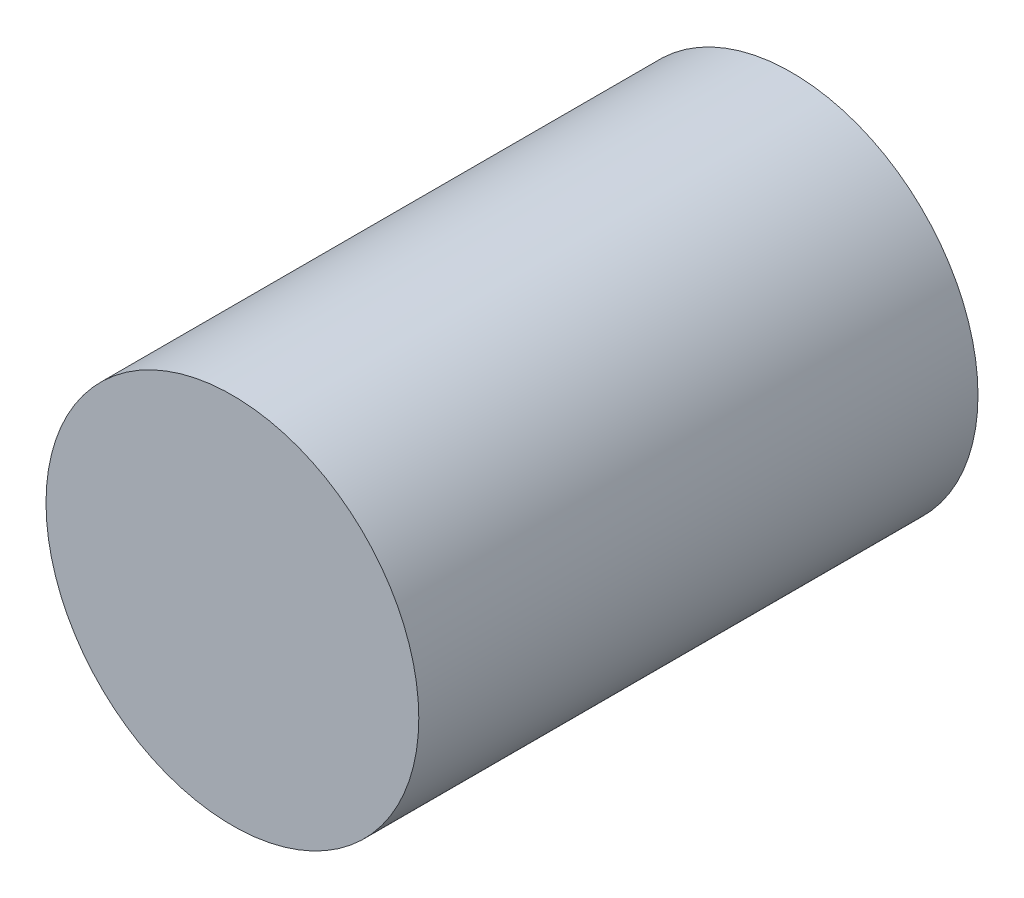
ISO-10303-21;
HEADER;
FILE_DESCRIPTION(('STEP AP214'),'2;1');
FILE_NAME('part.step','',(''),(''),'','','');
FILE_SCHEMA(('AUTOMOTIVE_DESIGN { 1 0 10303 214 1 1 1 1 }'));
ENDSEC;
DATA;
#1=APPLICATION_CONTEXT('core data for automotive mechanical design processes');
#2=APPLICATION_PROTOCOL_DEFINITION('international standard','automotive_design',2000,#1);
#3=PRODUCT_CONTEXT('',#1,'mechanical');
#4=PRODUCT('Part','Part','',(#3));
#5=PRODUCT_RELATED_PRODUCT_CATEGORY('part','',(#4));
#6=PRODUCT_DEFINITION_FORMATION('','',#4);
#7=PRODUCT_DEFINITION_CONTEXT('part definition',#1,'design');
#8=PRODUCT_DEFINITION('design','',#6,#7);
#9=PRODUCT_DEFINITION_SHAPE('','',#8);
#10=(LENGTH_UNIT() NAMED_UNIT(*) SI_UNIT(.MILLI.,.METRE.));
#11=(NAMED_UNIT(*) PLANE_ANGLE_UNIT() SI_UNIT($,.RADIAN.));
#12=(NAMED_UNIT(*) SI_UNIT($,.STERADIAN.) SOLID_ANGLE_UNIT());
#13=UNCERTAINTY_MEASURE_WITH_UNIT(LENGTH_MEASURE(1.E-05),#10,'distance_accuracy_value','');
#14=(GEOMETRIC_REPRESENTATION_CONTEXT(3) GLOBAL_UNCERTAINTY_ASSIGNED_CONTEXT((#13)) GLOBAL_UNIT_ASSIGNED_CONTEXT((#10,
#11,#12)) REPRESENTATION_CONTEXT('',''));
#15=CARTESIAN_POINT('',(0.,0.,0.));
#16=DIRECTION('',(0.,0.,1.));
#17=DIRECTION('',(1.,0.,0.));
#18=AXIS2_PLACEMENT_3D('',#15,#16,#17);
#19=CARTESIAN_POINT('',(0.,0.,27.));
#20=DIRECTION('',(0.,0.,-1.));
#21=DIRECTION('',(-1.,0.,0.));
#22=AXIS2_PLACEMENT_3D('',#19,#20,#21);
#23=CYLINDRICAL_SURFACE('',#22,9.);
#24=CARTESIAN_POINT('',(0.,0.,27.));
#25=DIRECTION('',(0.,0.,1.));
#26=DIRECTION('',(1.,0.,0.));
#27=AXIS2_PLACEMENT_3D('',#24,#25,#26);
#28=CIRCLE('',#27,9.);
#29=CARTESIAN_POINT('',(9.,0.,27.));
#30=VERTEX_POINT('',#29);
#31=EDGE_CURVE('E10',#30,#30,#28,.T.);
#32=ORIENTED_EDGE('',*,*,#31,.F.);
#33=EDGE_LOOP('',(#32));
#34=FACE_BOUND('',#33,.T.);
#35=CARTESIAN_POINT('',(0.,0.,0.));
#36=DIRECTION('',(0.,0.,1.));
#37=DIRECTION('',(1.,0.,0.));
#38=AXIS2_PLACEMENT_3D('',#35,#36,#37);
#39=CIRCLE('',#38,9.);
#40=CARTESIAN_POINT('',(9.,0.,0.));
#41=VERTEX_POINT('',#40);
#42=EDGE_CURVE('E42',#41,#41,#39,.T.);
#43=ORIENTED_EDGE('',*,*,#42,.T.);
#44=EDGE_LOOP('',(#43));
#45=FACE_BOUND('',#44,.T.);
#46=ADVANCED_FACE('F41',(#34,#45),#23,.T.);
#47=CARTESIAN_POINT('',(0.,0.,27.));
#48=DIRECTION('',(0.,0.,1.));
#49=DIRECTION('',(1.,0.,0.));
#50=AXIS2_PLACEMENT_3D('',#47,#48,#49);
#51=PLANE('',#50);
#52=ORIENTED_EDGE('',*,*,#31,.T.);
#53=EDGE_LOOP('',(#52));
#54=FACE_BOUND('',#53,.T.);
#55=ADVANCED_FACE('F58',(#54),#51,.T.);
#56=CARTESIAN_POINT('',(0.,0.,0.));
#57=DIRECTION('',(0.,0.,1.));
#58=DIRECTION('',(1.,0.,0.));
#59=AXIS2_PLACEMENT_3D('',#56,#57,#58);
#60=PLANE('',#59);
#61=ORIENTED_EDGE('',*,*,#42,.F.);
#62=EDGE_LOOP('',(#61));
#63=FACE_BOUND('',#62,.T.);
#64=ADVANCED_FACE('F59',(#63),#60,.F.);
#65=CLOSED_SHELL('',(#46,#55,#64));
#66=MANIFOLD_SOLID_BREP('B2',#65);
#67=ADVANCED_BREP_SHAPE_REPRESENTATION('',(#18,#66),#14);
#68=SHAPE_DEFINITION_REPRESENTATION(#9,#67);
ENDSEC;
END-ISO-10303-21;
